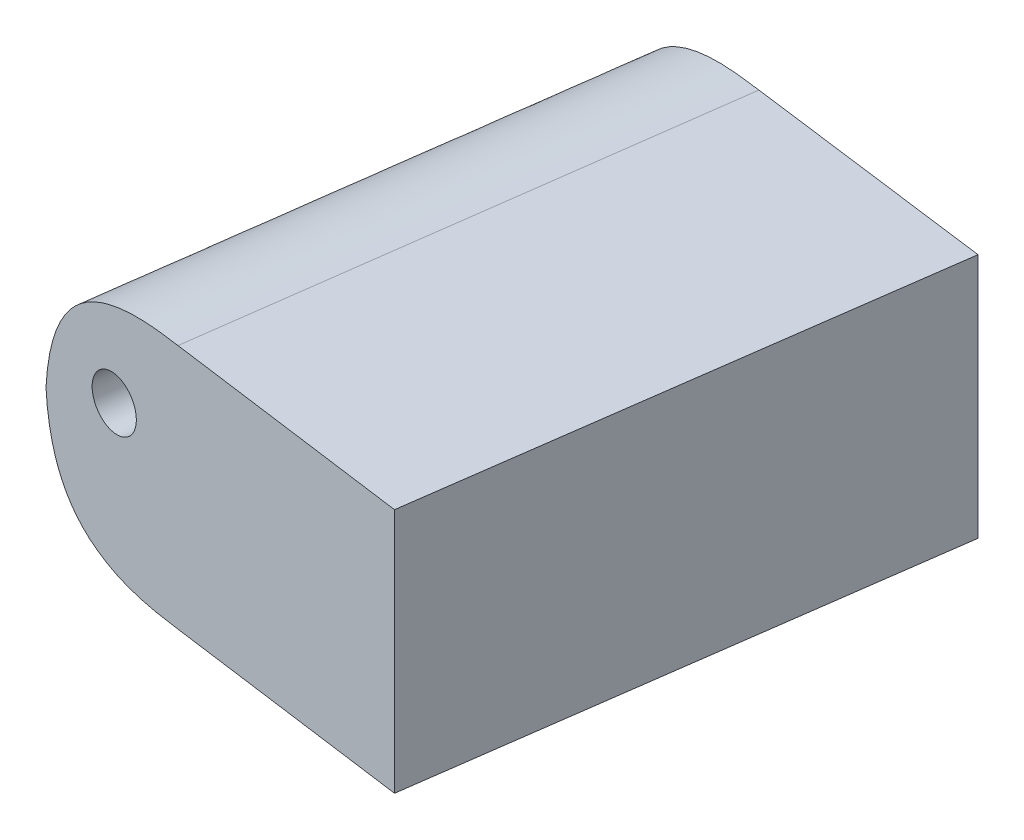
ISO-10303-21;
HEADER;
FILE_DESCRIPTION(('STEP AP214'),'2;1');
FILE_NAME('part.step','',(''),(''),'','','');
FILE_SCHEMA(('AUTOMOTIVE_DESIGN { 1 0 10303 214 1 1 1 1 }'));
ENDSEC;
DATA;
#1=APPLICATION_CONTEXT('core data for automotive mechanical design processes');
#2=APPLICATION_PROTOCOL_DEFINITION('international standard','automotive_design',2000,#1);
#3=PRODUCT_CONTEXT('',#1,'mechanical');
#4=PRODUCT('Part','Part','',(#3));
#5=PRODUCT_RELATED_PRODUCT_CATEGORY('part','',(#4));
#6=PRODUCT_DEFINITION_FORMATION('','',#4);
#7=PRODUCT_DEFINITION_CONTEXT('part definition',#1,'design');
#8=PRODUCT_DEFINITION('design','',#6,#7);
#9=PRODUCT_DEFINITION_SHAPE('','',#8);
#10=(LENGTH_UNIT() NAMED_UNIT(*) SI_UNIT(.MILLI.,.METRE.));
#11=(NAMED_UNIT(*) PLANE_ANGLE_UNIT() SI_UNIT($,.RADIAN.));
#12=(NAMED_UNIT(*) SI_UNIT($,.STERADIAN.) SOLID_ANGLE_UNIT());
#13=UNCERTAINTY_MEASURE_WITH_UNIT(LENGTH_MEASURE(1.E-05),#10,'distance_accuracy_value','');
#14=(GEOMETRIC_REPRESENTATION_CONTEXT(3) GLOBAL_UNCERTAINTY_ASSIGNED_CONTEXT((#13)) GLOBAL_UNIT_ASSIGNED_CONTEXT((#10,
#11,#12)) REPRESENTATION_CONTEXT('',''));
#15=CARTESIAN_POINT('',(0.,0.,0.));
#16=DIRECTION('',(0.,0.,1.));
#17=DIRECTION('',(1.,0.,0.));
#18=AXIS2_PLACEMENT_3D('',#15,#16,#17);
#19=CARTESIAN_POINT('',(-26.8764323882706,9.525,-11.3170154040948));
#20=DIRECTION('',(-0.990563834972414,0.,-0.137052139146914));
#21=DIRECTION('',(-0.137052139146914,0.,0.990563834972414));
#22=AXIS2_PLACEMENT_3D('',#19,#20,#21);
#23=PLANE('',#22);
#24=DIRECTION('',(0.137052139146914,0.,-0.990563834972414));
#25=VECTOR('',#24,1.);
#26=CARTESIAN_POINT('',(-26.8764323882706,0.,-11.3170154040948));
#27=LINE('',#26,#25);
#28=CARTESIAN_POINT('',(-29.6265442564145,0.,8.55980939899429));
#29=VERTEX_POINT('',#28);
#30=CARTESIAN_POINT('',(-26.8764323882706,0.,-11.3170154040948));
#31=VERTEX_POINT('',#30);
#32=EDGE_CURVE('E129',#29,#31,#27,.T.);
#33=ORIENTED_EDGE('',*,*,#32,.T.);
#34=DIRECTION('',(0.,-1.,0.));
#35=VECTOR('',#34,1.);
#36=CARTESIAN_POINT('',(-26.8764323882706,9.525,-11.3170154040948));
#37=LINE('',#36,#35);
#38=CARTESIAN_POINT('',(-26.8764323882706,9.525,-11.3170154040948));
#39=VERTEX_POINT('',#38);
#40=EDGE_CURVE('E110',#39,#31,#37,.T.);
#41=ORIENTED_EDGE('',*,*,#40,.F.);
#42=DIRECTION('',(0.137052139146914,0.,-0.990563834972414));
#43=VECTOR('',#42,1.);
#44=CARTESIAN_POINT('',(-26.8764323882706,9.525,-11.3170154040948));
#45=LINE('',#44,#43);
#46=CARTESIAN_POINT('',(-29.6265442564145,9.525,8.55980939899429));
#47=VERTEX_POINT('',#46);
#48=EDGE_CURVE('E118',#47,#39,#45,.T.);
#49=ORIENTED_EDGE('',*,*,#48,.F.);
#50=DIRECTION('',(0.,-1.,0.));
#51=VECTOR('',#50,1.);
#52=CARTESIAN_POINT('',(-29.6265442564145,9.525,8.55980939899429));
#53=LINE('',#52,#51);
#54=EDGE_CURVE('E131',#47,#29,#53,.T.);
#55=ORIENTED_EDGE('',*,*,#54,.T.);
#56=EDGE_LOOP('',(#33,#41,#49,#55));
#57=FACE_BOUND('',#56,.T.);
#58=ADVANCED_FACE('F53',(#57),#23,.F.);
#59=CARTESIAN_POINT('',(-42.6007112345076,9.525,-13.3780058589725));
#60=DIRECTION('',(-0.129959025005187,0.,0.991519365327628));
#61=DIRECTION('',(0.991519365327628,0.,0.129959025005187));
#62=AXIS2_PLACEMENT_3D('',#59,#60,#61);
#63=PLANE('',#62);
#64=CARTESIAN_POINT('',(-39.5944244871057,5.969,-12.9839700909981));
#65=DIRECTION('',(0.129959025005187,0.,-0.991519365327628));
#66=DIRECTION('',(-0.991519365327628,0.,-0.129959025005187));
#67=AXIS2_PLACEMENT_3D('',#64,#65,#66);
#68=CIRCLE('',#67,2.032);
#69=CARTESIAN_POINT('',(-41.6091918374514,5.969,-13.2480468298086));
#70=VERTEX_POINT('',#69);
#71=EDGE_CURVE('E139',#70,#70,#68,.T.);
#72=ORIENTED_EDGE('',*,*,#71,.F.);
#73=EDGE_LOOP('',(#72));
#74=FACE_BOUND('',#73,.T.);
#75=CARTESIAN_POINT('',(-42.5732892059843,4.76250042327569,-13.3744116376036));
#76=CARTESIAN_POINT('',(-42.5647958977979,4.62809784797724,-13.3732990782794));
#77=CARTESIAN_POINT('',(-42.553743054954,4.49379104343409,-13.371870272776));
#78=CARTESIAN_POINT('',(-42.5247729563878,4.21849101499363,-13.3681420552876));
#79=CARTESIAN_POINT('',(-42.506512657539,4.07753479702576,-13.3657992165633));
#80=CARTESIAN_POINT('',(-42.4727809971869,3.86452101191241,-13.3614677959091));
#81=CARTESIAN_POINT('',(-42.4602064141451,3.79199611332065,-13.3598525979796));
#82=CARTESIAN_POINT('',(-42.4324934385158,3.6458524221412,-13.3562902671087));
#83=CARTESIAN_POINT('',(-42.4173064371706,3.57224294453682,-13.3543368350782));
#84=CARTESIAN_POINT('',(-42.3840891718527,3.42421259612409,-13.350060222277));
#85=CARTESIAN_POINT('',(-42.3660105618139,3.34980271301365,-13.3477307466914));
#86=CARTESIAN_POINT('',(-42.3267283174173,3.20049686394299,-13.3426639617381));
#87=CARTESIAN_POINT('',(-42.3054776760046,3.12561342269257,-13.3399205093968));
#88=CARTESIAN_POINT('',(-42.2595680625844,2.97572827201594,-13.3339874653526));
#89=CARTESIAN_POINT('',(-42.2348643250654,2.90074045458113,-13.3307920060353));
#90=CARTESIAN_POINT('',(-42.1817651823831,2.75105185464563,-13.3239166429932));
#91=CARTESIAN_POINT('',(-42.1533278206104,2.67636614643373,-13.3202312263371));
#92=CARTESIAN_POINT('',(-42.0924812694144,2.52772117270588,-13.3123380654591));
#93=CARTESIAN_POINT('',(-42.0600329384801,2.45377816099321,-13.308125167626));
#94=CARTESIAN_POINT('',(-41.9908829419822,2.30707307555885,-13.2991390010622));
#95=CARTESIAN_POINT('',(-41.9541440113329,2.23432874289674,-13.2943608171706));
#96=CARTESIAN_POINT('',(-41.8957801589619,2.12670551961301,-13.286763712819));
#97=CARTESIAN_POINT('',(-41.8757099790418,2.09096242662776,-13.2841501923355));
#98=CARTESIAN_POINT('',(-41.834401999416,2.01995293692127,-13.2787689626195));
#99=CARTESIAN_POINT('',(-41.813159391443,1.98468937718113,-13.276000617704));
#100=CARTESIAN_POINT('',(-41.7694744435022,1.91469848113969,-13.2703053907542));
#101=CARTESIAN_POINT('',(-41.7470270117249,1.87997437698258,-13.2673778350414));
#102=CARTESIAN_POINT('',(-41.7008999550341,1.81111869084117,-13.2613597949436));
#103=CARTESIAN_POINT('',(-41.6772148018876,1.77699087312801,-13.2582685785931));
#104=CARTESIAN_POINT('',(-41.6285804588179,1.70938226987987,-13.2519189076482));
#105=CARTESIAN_POINT('',(-41.6036251414069,1.67590596578158,-13.2486596411229));
#106=CARTESIAN_POINT('',(-41.5524189628733,1.60965172149761,-13.2419696057797));
#107=CARTESIAN_POINT('',(-41.5261612042989,1.57687920161246,-13.2385379222802));
#108=CARTESIAN_POINT('',(-41.4723190033124,1.51207995581395,-13.2314988380954));
#109=CARTESIAN_POINT('',(-41.444726727298,1.48005984908226,-13.2278903977123));
#110=CARTESIAN_POINT('',(-41.388184637583,1.41680795091697,-13.2204936236189));
#111=CARTESIAN_POINT('',(-41.3592259054556,1.38558426804663,-13.2167041051652));
#112=CARTESIAN_POINT('',(-41.2999202769971,1.32396185645937,-13.2089410283843));
#113=CARTESIAN_POINT('',(-41.269563263105,1.29357303312973,-13.2049661246921));
#114=CARTESIAN_POINT('',(-41.20743246355,1.23365173551807,-13.1968284002191));
#115=CARTESIAN_POINT('',(-41.1756473633469,1.20413119809158,-13.192664073311));
#116=CARTESIAN_POINT('',(-41.1106379117189,1.1459765630196,-13.184144458969));
#117=CARTESIAN_POINT('',(-41.0774012602499,1.11735645839199,-13.1797875326404));
#118=CARTESIAN_POINT('',(-41.0094734171707,1.06103264844363,-13.170880649869));
#119=CARTESIAN_POINT('',(-40.9747692245022,1.03334490284984,-13.166328959629));
#120=CARTESIAN_POINT('',(-40.9038983369239,0.978915515873346,-13.1570314714318));
#121=CARTESIAN_POINT('',(-40.867718239456,0.952191640320728,-13.1522838847861));
#122=CARTESIAN_POINT('',(-40.7938949822682,0.899719307596912,-13.1425945282852));
#123=CARTESIAN_POINT('',(-40.7562383149864,0.873990199891915,-13.1376509545929));
#124=CARTESIAN_POINT('',(-40.6794688072314,0.823536151644567,-13.1275705568274));
#125=CARTESIAN_POINT('',(-40.6403426324152,0.798831872170548,-13.1224319511875));
#126=CARTESIAN_POINT('',(-40.5606484521346,0.750455454108743,-13.1119634311337));
#127=CARTESIAN_POINT('',(-40.5200675333938,0.726804981129649,-13.1066317908757));
#128=CARTESIAN_POINT('',(-40.4374856125969,0.680563123019994,-13.0957801452615));
#129=CARTESIAN_POINT('',(-40.3954723274306,0.657994081068855,-13.0902584981186));
#130=CARTESIAN_POINT('',(-40.3100547325321,0.613940717136585,-13.0790307716878));
#131=CARTESIAN_POINT('',(-40.2666389358746,0.592479083592643,-13.0733231572748));
#132=CARTESIAN_POINT('',(-40.1784524735771,0.550664502490672,-13.061728389582));
#133=CARTESIAN_POINT('',(-40.1336712381129,0.530334263479674,-13.0558398244101));
#134=CARTESIAN_POINT('',(-40.0427970658191,0.490804456772829,-13.0438889966318));
#135=CARTESIAN_POINT('',(-39.9966945568674,0.47162731159011,-13.0378254565076));
#136=CARTESIAN_POINT('',(-39.9032270630086,0.434423039424043,-13.0255313417205));
#137=CARTESIAN_POINT('',(-39.8558535353756,0.416417765257426,-13.0192996284792));
#138=CARTESIAN_POINT('',(-39.7599012416368,0.381574396294286,-13.0066769068999));
#139=CARTESIAN_POINT('',(-39.7113149951149,0.364757346571228,-13.0002849034894));
#140=CARTESIAN_POINT('',(-39.5628315482338,0.315743247934743,-12.9807496721169));
#141=CARTESIAN_POINT('',(-39.4622049465041,0.285773055919237,-12.9675096937149));
#142=CARTESIAN_POINT('',(-39.2569558339936,0.230538213950909,-12.940504085472));
#143=CARTESIAN_POINT('',(-39.1522968657922,0.205413075320201,-12.9267336615808));
#144=CARTESIAN_POINT('',(-38.9395668609517,0.159849425665994,-12.8987462091978));
#145=CARTESIAN_POINT('',(-38.8314715563698,0.139526866741655,-12.8845260393316));
#146=CARTESIAN_POINT('',(-38.6124853099318,0.103449913614241,-12.8557225140639));
#147=CARTESIAN_POINT('',(-38.5015796809641,0.0877871469969634,-12.8411373115314));
#148=CARTESIAN_POINT('',(-38.2775659546188,0.0607837106360176,-12.8116840264542));
#149=CARTESIAN_POINT('',(-38.1644498387937,0.0495116711115955,-12.796814991291));
#150=CARTESIAN_POINT('',(-37.9365341254753,0.0308780311281911,-12.7668642807237));
#151=CARTESIAN_POINT('',(-37.8217306694735,0.0235651990272983,-12.7517822024035));
#152=CARTESIAN_POINT('',(-37.590832601146,0.0122782293590347,-12.7214586705435));
#153=CARTESIAN_POINT('',(-37.4747364914305,0.00833797882012555,-12.7062171220861));
#154=CARTESIAN_POINT('',(-37.1229572727762,0.000113538461828667,-12.6600497854791));
#155=CARTESIAN_POINT('',(-36.8871597244518,-0.000351603179588617,-12.6291250339052));
#156=CARTESIAN_POINT('',(-36.6515433930548,0.,-12.5982449392128));
#157=B_SPLINE_CURVE_WITH_KNOTS('',3,(#75,#76,#77,#78,#79,#80,#81,#82,#83,#84,#85,#86,#87,#88,
#89,#90,#91,#92,#93,#94,#95,#96,#97,#98,#99,#100,#101,#102,#103,#104,#105,#106,#107,#108,#109,
#110,#111,#112,#113,#114,#115,#116,#117,#118,#119,#120,#121,#122,#123,#124,#125,#126,#127,#128,
#129,#130,#131,#132,#133,#134,#135,#136,#137,#138,#139,#140,#141,#142,#143,#144,#145,#146,#147,
#148,#149,#150,#151,#152,#153,#154,#155,#156),.UNSPECIFIED.,.F.,.F.,(4,2,2,2,2,2,2,2,2,2,2,2,2,
2,2,2,2,2,2,2,2,2,2,2,2,2,2,2,2,2,2,2,2,2,2,2,2,2,2,2,4),(0.,0.404114168840457,
0.830378471591303,1.05121962296759,1.2767325515803,1.50651098932134,1.74011407212345,
1.9770887339085,2.21700021740357,2.45947153305623,2.70423212388337,2.8274433041151,
2.95120399512992,3.07553676376821,3.20048238269704,3.32610175991265,3.45247770278985,
3.57971643402706,3.70794877326394,3.83733073279795,3.96803593068444,4.10023544924245,
4.23409012154197,4.36974766730105,4.50734013965957,4.64698171868899,4.78876690217423,
4.93276912611677,5.07903983133111,5.22760797932652,5.37848001074875,5.5316402329531,
5.68705161945368,6.00435004548754,6.32974120407924,6.66232947111887,7.00108069383517,
7.34493259616978,7.69292880510658,8.0443818860083,8.75751923929178),.UNSPECIFIED.);
#158=CARTESIAN_POINT('',(-36.6515433930548,0.,-12.5982449392128));
#159=VERTEX_POINT('',#158);
#160=CARTESIAN_POINT('',(-42.5732848257656,4.76250027694889,-13.3744110634857));
#161=VERTEX_POINT('',#160);
#162=EDGE_CURVE('E74',#159,#161,#157,.F.);
#163=ORIENTED_EDGE('',*,*,#162,.T.);
#164=CARTESIAN_POINT('',(-36.6515433930551,9.525,-12.5982449392128));
#165=CARTESIAN_POINT('',(-36.8871597128886,9.52535160311408,-12.62912503239));
#166=CARTESIAN_POINT('',(-37.1229572496091,9.52488646156102,-12.6600497824381));
#167=CARTESIAN_POINT('',(-37.4747364505127,9.51666202238325,-12.7062171167042));
#168=CARTESIAN_POINT('',(-37.5908325540556,9.51272177242049,-12.7214586643466));
#169=CARTESIAN_POINT('',(-37.8217306098353,9.50143480441091,-12.7517821945478));
#170=CARTESIAN_POINT('',(-37.936534059462,9.4941219733965,-12.7668642720242));
#171=CARTESIAN_POINT('',(-38.1644497599251,9.47548833619764,-12.7968149808884));
#172=CARTESIAN_POINT('',(-38.2775658692696,9.46421629837329,-12.8116840151923));
#173=CARTESIAN_POINT('',(-38.5015795826722,9.43721286611362,-12.841137298552));
#174=CARTESIAN_POINT('',(-38.6124852051768,9.42155010189571,-12.855722500226));
#175=CARTESIAN_POINT('',(-38.831471438848,9.38547315433752,-12.8845260237974));
#176=CARTESIAN_POINT('',(-38.9395667371238,9.36515059857601,-12.8987461928251));
#177=CARTESIAN_POINT('',(-39.1522967296605,9.31958695607113,-12.9267336435718));
#178=CARTESIAN_POINT('',(-39.2569556918592,9.29446182141409,-12.9405040666643));
#179=CARTESIAN_POINT('',(-39.4622047928148,9.23922698825737,-12.9675096733694));
#180=CARTESIAN_POINT('',(-39.5628313889839,9.20925680106149,-12.9807496510314));
#181=CARTESIAN_POINT('',(-39.711314827947,9.16024271036438,-13.0002848813498));
#182=CARTESIAN_POINT('',(-39.7599010719076,9.14342566338049,-13.0066768844194));
#183=CARTESIAN_POINT('',(-39.8558533606841,9.1085823001173,-13.0192996053382));
#184=CARTESIAN_POINT('',(-39.9032268859144,9.09057702890852,-13.0255313182596));
#185=CARTESIAN_POINT('',(-39.9966943751415,9.05337276288089,-13.0378254324302));
#186=CARTESIAN_POINT('',(-40.0427968818622,9.03419562087579,-13.0438889722576));
#187=CARTESIAN_POINT('',(-40.1336710498789,8.9946658207478,-13.0558397994667));
#188=CARTESIAN_POINT('',(-40.1784522832949,8.97433558513517,-13.0617283643661));
#189=CARTESIAN_POINT('',(-40.2666387416903,8.93252101105383,-13.0733231315398));
#190=CARTESIAN_POINT('',(-40.3100545364915,8.91105938112954,-13.079030745706));
#191=CARTESIAN_POINT('',(-40.3954721278789,8.86700602466033,-13.09025847167));
#192=CARTESIAN_POINT('',(-40.437485411388,8.84443698655038,-13.0957801185926));
#193=CARTESIAN_POINT('',(-40.5200673290768,8.79819513634636,-13.1066317637939));
#194=CARTESIAN_POINT('',(-40.5606482463643,8.77454466743004,-13.1119634038589));
#195=CARTESIAN_POINT('',(-40.640342423947,8.7261682577162,-13.1224319235546));
#196=CARTESIAN_POINT('',(-40.6794685975162,8.70146398252638,-13.1275705290291));
#197=CARTESIAN_POINT('',(-40.7562381029856,8.65100994306877,-13.1376509264916));
#198=CARTESIAN_POINT('',(-40.7938947692266,8.62528083986914,-13.1425945000461));
#199=CARTESIAN_POINT('',(-40.8677180245382,8.5728085163761,-13.1522838562988));
#200=CARTESIAN_POINT('',(-40.903898121169,8.54608464554966,-13.1570314428339));
#201=CARTESIAN_POINT('',(-40.974769007272,8.49165526824416,-13.1663289308365));
#202=CARTESIAN_POINT('',(-41.0094731993015,8.46396752759694,-13.1708806209923));
#203=CARTESIAN_POINT('',(-41.0774010412924,8.40764372775899,-13.1797875036209));
#204=CARTESIAN_POINT('',(-41.1106376923122,8.37902362829797,-13.1841444298907));
#205=CARTESIAN_POINT('',(-41.1756471432192,8.32086900377511,-13.1926640441388));
#206=CARTESIAN_POINT('',(-41.2074322431516,8.29134847173487,-13.1968283710119));
#207=CARTESIAN_POINT('',(-41.2695630423276,8.23142718511035,-13.2049660954367));
#208=CARTESIAN_POINT('',(-41.2999200561135,8.20103836738615,-13.2089409991159));
#209=CARTESIAN_POINT('',(-41.359225684511,8.13941596721555,-13.2167040758909));
#210=CARTESIAN_POINT('',(-41.3881844166869,8.10819229016139,-13.2204935943521));
#211=CARTESIAN_POINT('',(-41.4447265066483,8.04494040381652,-13.2278903684806));
#212=CARTESIAN_POINT('',(-41.4723187828644,8.0129203030939,-13.2314988088916));
#213=CARTESIAN_POINT('',(-41.5261609844028,7.94812106948312,-13.2385378931521));
#214=CARTESIAN_POINT('',(-41.5524187433314,7.9153485557812,-13.2419695766999));
#215=CARTESIAN_POINT('',(-41.6036249227203,7.84909432401471,-13.2486596121592));
#216=CARTESIAN_POINT('',(-41.6285802406364,7.81561802625484,-13.2519188787529));
#217=CARTESIAN_POINT('',(-41.6772145848617,7.7480094358161,-13.2582685498539));
#218=CARTESIAN_POINT('',(-41.7008997386625,7.71388162457766,-13.2613597662926));
#219=CARTESIAN_POINT('',(-41.7470267968051,7.64502595149983,-13.2673778065859));
#220=CARTESIAN_POINT('',(-41.7694742293835,7.6103018539349,-13.2703053624064));
#221=CARTESIAN_POINT('',(-41.8131591790672,7.54031097117397,-13.2760005895905));
#222=CARTESIAN_POINT('',(-41.8344017879853,7.50504741812504,-13.2787689346329));
#223=CARTESIAN_POINT('',(-41.875709769639,7.43403794187929,-13.2841501646211));
#224=CARTESIAN_POINT('',(-41.8957799506449,7.39829485566604,-13.2867636852502));
#225=CARTESIAN_POINT('',(-41.9541438063731,7.29067165291624,-13.2943607900523));
#226=CARTESIAN_POINT('',(-41.9908827396177,7.21792733398184,-13.2991389742914));
#227=CARTESIAN_POINT('',(-42.0600327417979,7.07122227610879,-13.3081251416156));
#228=CARTESIAN_POINT('',(-42.0924810758347,6.99727927824193,-13.3123380398636));
#229=CARTESIAN_POINT('',(-42.1533276336883,6.84863433219997,-13.3202312016313));
#230=CARTESIAN_POINT('',(-42.1817649990261,6.77394863783716,-13.3239166187637));
#231=CARTESIAN_POINT('',(-42.2348641492434,6.62426006549527,-13.3307919828116));
#232=CARTESIAN_POINT('',(-42.2595678907377,6.54927226181196,-13.3339874426593));
#233=CARTESIAN_POINT('',(-42.3054775124564,6.39938713845278,-13.3399204878101));
#234=CARTESIAN_POINT('',(-42.3267281581947,6.32450371077411,-13.3426639407279));
#235=CARTESIAN_POINT('',(-42.3660104115248,6.17519788859932,-13.347730726871));
#236=CARTESIAN_POINT('',(-42.3840890261719,6.1007880188182,-13.35006020307));
#237=CARTESIAN_POINT('',(-42.4173063009168,5.95275769677425,-13.3543368171252));
#238=CARTESIAN_POINT('',(-42.43249330708,5.87914823221428,-13.3562902497962));
#239=CARTESIAN_POINT('',(-42.4602062924734,5.73300456681303,-13.359852581964));
#240=CARTESIAN_POINT('',(-42.4727808804608,5.66047968095986,-13.36146778055));
#241=CARTESIAN_POINT('',(-42.5065125555083,5.44746593339397,-13.3657992031531));
#242=CARTESIAN_POINT('',(-42.5247728643959,5.30650973999141,-13.3681420432063));
#243=CARTESIAN_POINT('',(-42.5537429824402,5.03120975966589,-13.371870263266));
#244=CARTESIAN_POINT('',(-42.5647958347616,4.8969029787074,-13.373299070017));
#245=CARTESIAN_POINT('',(-42.5732891521375,4.76250042674533,-13.3744116305458));
#246=B_SPLINE_CURVE_WITH_KNOTS('',3,(#164,#165,#166,#167,#168,#169,#170,#171,#172,#173,#174,
#175,#176,#177,#178,#179,#180,#181,#182,#183,#184,#185,#186,#187,#188,#189,#190,#191,#192,#193,
#194,#195,#196,#197,#198,#199,#200,#201,#202,#203,#204,#205,#206,#207,#208,#209,#210,#211,#212,
#213,#214,#215,#216,#217,#218,#219,#220,#221,#222,#223,#224,#225,#226,#227,#228,#229,#230,#231,
#232,#233,#234,#235,#236,#237,#238,#239,#240,#241,#242,#243,#244,#245),.UNSPECIFIED.,.F.,.F.,(4,
2,2,2,2,2,2,2,2,2,2,2,2,2,2,2,2,2,2,2,2,2,2,2,2,2,2,2,2,2,2,2,2,2,2,2,2,2,2,2,4),(0.,
0.7131373182425,1.06459038042347,1.41258656991711,1.75643845225367,2.0951896546276,
2.42777790120027,2.75316903939687,3.07046744524933,3.22587882175653,3.3790390340346,
3.529911055588,3.67847919375448,3.82474988915411,3.96875210326216,4.11053727685099,
4.25017884587203,4.38777130805285,4.52342884340118,4.65728350498781,4.7894830124577,
4.92018819880517,5.04957014627349,5.1778024728754,5.30504119091319,5.43141712004197,
5.55703648298251,5.68198208713793,5.80631484053748,5.93007551588499,6.05328668006023,
6.29804723777519,6.54051851925598,6.78042996784234,7.01740459427676,7.25100764154124,
7.4807860437648,7.7062989370353,7.92714005334605,8.35340428693263,8.75751838762713),.UNSPECIFIED.);
#247=CARTESIAN_POINT('',(-36.6515433930551,9.525,-12.5982449392128));
#248=VERTEX_POINT('',#247);
#249=EDGE_CURVE('E67',#161,#248,#246,.F.);
#250=ORIENTED_EDGE('',*,*,#249,.T.);
#251=DIRECTION('',(-0.991519365327628,0.,-0.129959025005187));
#252=VECTOR('',#251,1.);
#253=CARTESIAN_POINT('',(-42.6007112345076,9.525,-13.3780058589725));
#254=LINE('',#253,#252);
#255=EDGE_CURVE('E106',#39,#248,#254,.T.);
#256=ORIENTED_EDGE('',*,*,#255,.F.);
#257=ORIENTED_EDGE('',*,*,#40,.T.);
#258=DIRECTION('',(-0.991519365327628,0.,-0.129959025005187));
#259=VECTOR('',#258,1.);
#260=CARTESIAN_POINT('',(-42.6007112345076,0.,-13.3780058589725));
#261=LINE('',#260,#259);
#262=EDGE_CURVE('E150',#31,#159,#261,.T.);
#263=ORIENTED_EDGE('',*,*,#262,.T.);
#264=EDGE_LOOP('',(#163,#250,#256,#257,#263));
#265=FACE_BOUND('',#264,.T.);
#266=ADVANCED_FACE('F108',(#74,#265),#63,.F.);
#267=CARTESIAN_POINT('',(-29.6265442564145,9.525,8.55980939899429));
#268=DIRECTION('',(0.134089514644196,0.,-0.990969223569776));
#269=DIRECTION('',(-0.990969223569776,0.,-0.134089514644196));
#270=AXIS2_PLACEMENT_3D('',#267,#268,#269);
#271=PLANE('',#270);
#272=CARTESIAN_POINT('',(-42.1952694970725,5.969,6.85911655492695));
#273=DIRECTION('',(0.134089514644196,0.,-0.990969223569776));
#274=DIRECTION('',(-0.990969223569776,0.,-0.134089514644196));
#275=AXIS2_PLACEMENT_3D('',#272,#273,#274);
#276=ELLIPSE('',#275,1.00000871387596,1.000000032);
#277=CARTESIAN_POINT('',(-43.1862473558252,5.969,6.72502587184335));
#278=VERTEX_POINT('',#277);
#279=EDGE_CURVE('E137',#278,#278,#276,.T.);
#280=ORIENTED_EDGE('',*,*,#279,.T.);
#281=EDGE_LOOP('',(#280));
#282=FACE_BOUND('',#281,.T.);
#283=DIRECTION('',(0.990969223569776,0.,0.134089514644196));
#284=VECTOR('',#283,1.);
#285=CARTESIAN_POINT('',(-29.6265442564145,9.525,8.55980939899429));
#286=LINE('',#285,#284);
#287=CARTESIAN_POINT('',(-39.3366861859724,9.525,7.24591570028752));
#288=VERTEX_POINT('',#287);
#289=EDGE_CURVE('E117',#288,#47,#286,.T.);
#290=ORIENTED_EDGE('',*,*,#289,.F.);
#291=CARTESIAN_POINT('',(-45.2825015273915,3.525,6.44137861242268));
#292=CARTESIAN_POINT('',(-45.2825015273911,4.53418830920277,6.44137861242273));
#293=CARTESIAN_POINT('',(-45.2825015273911,5.54337661840555,6.44137861242273));
#294=CARTESIAN_POINT('',(-44.8562346105703,7.7676406871202,6.49905742083112));
#295=CARTESIAN_POINT('',(-43.5410125335617,9.0948484809826,6.67702206974237));
#296=CARTESIAN_POINT('',(-41.336835296387,9.525,6.97527255915647));
#297=CARTESIAN_POINT('',(-40.3367607411797,9.525,7.11059412972219));
#298=CARTESIAN_POINT('',(-39.3366861859724,9.525,7.24591570028791));
#299=B_SPLINE_CURVE_WITH_KNOTS('',5,(#291,#292,#293,#294,#295,#296,#297,#298),.UNSPECIFIED.,.F.,
.F.,(6,2,6),(0.,0.5,1.),.UNSPECIFIED.);
#300=CARTESIAN_POINT('',(-45.2550935317883,4.76250424083748,6.44508722893669));
#301=VERTEX_POINT('',#300);
#302=EDGE_CURVE('E224',#288,#301,#299,.F.);
#303=ORIENTED_EDGE('',*,*,#302,.T.);
#304=CARTESIAN_POINT('',(-39.3366861859723,0.,7.24591570028814));
#305=CARTESIAN_POINT('',(-40.3367607411795,0.,7.11059412972242));
#306=CARTESIAN_POINT('',(-41.3368352963868,0.,6.9752725591567));
#307=CARTESIAN_POINT('',(-43.5410125335629,0.430151519016089,6.67702206974197));
#308=CARTESIAN_POINT('',(-44.8562346105706,1.75735931288097,6.49905742083072));
#309=CARTESIAN_POINT('',(-45.2825015273909,3.98162338159434,6.44137861242257));
#310=CARTESIAN_POINT('',(-45.2825015273909,4.99081169079717,6.44137861242296));
#311=CARTESIAN_POINT('',(-45.2825015273915,6.,6.44137861242287));
#312=B_SPLINE_CURVE_WITH_KNOTS('',5,(#304,#305,#306,#307,#308,#309,#310,#311),.UNSPECIFIED.,.F.,
.F.,(6,2,6),(0.,0.5,1.),.UNSPECIFIED.);
#313=CARTESIAN_POINT('',(-39.3366861859722,0.,7.24591570028755));
#314=VERTEX_POINT('',#313);
#315=EDGE_CURVE('E133',#301,#314,#312,.F.);
#316=ORIENTED_EDGE('',*,*,#315,.T.);
#317=DIRECTION('',(0.990969223569776,0.,0.134089514644196));
#318=VECTOR('',#317,1.);
#319=CARTESIAN_POINT('',(-29.6265442564145,0.,8.55980939899429));
#320=LINE('',#319,#318);
#321=EDGE_CURVE('E126',#314,#29,#320,.T.);
#322=ORIENTED_EDGE('',*,*,#321,.T.);
#323=ORIENTED_EDGE('',*,*,#54,.F.);
#324=EDGE_LOOP('',(#290,#303,#316,#322,#323));
#325=FACE_BOUND('',#324,.T.);
#326=ADVANCED_FACE('F173',(#282,#325),#271,.F.);
#327=CARTESIAN_POINT('',(0.,9.525,0.));
#328=DIRECTION('',(0.,-1.,0.));
#329=DIRECTION('',(0.,0.,-1.));
#330=AXIS2_PLACEMENT_3D('',#327,#328,#329);
#331=PLANE('',#330);
#332=ORIENTED_EDGE('',*,*,#255,.T.);
#333=CARTESIAN_POINT('',(-39.4709433256187,9.525,8.23812373226248));
#334=CARTESIAN_POINT('',(-38.4863909682121,9.525,0.961931497781003));
#335=CARTESIAN_POINT('',(-37.5018386108154,9.525,-6.31426073670631));
#336=CARTESIAN_POINT('',(-36.5172862534088,9.525,-13.5904529711878));
#337=B_SPLINE_CURVE_WITH_KNOTS('',3,(#333,#334,#335,#336),.UNSPECIFIED.,.F.,.F.,(4,4),
(-0.00857113543897676,0.0134563667117127),.UNSPECIFIED.);
#338=EDGE_CURVE('E130',#248,#288,#337,.F.);
#339=ORIENTED_EDGE('',*,*,#338,.T.);
#340=ORIENTED_EDGE('',*,*,#289,.T.);
#341=ORIENTED_EDGE('',*,*,#48,.T.);
#342=EDGE_LOOP('',(#332,#339,#340,#341));
#343=FACE_BOUND('',#342,.T.);
#344=ADVANCED_FACE('F121',(#343),#331,.F.);
#345=CARTESIAN_POINT('',(0.,0.,0.));
#346=DIRECTION('',(0.,-1.,0.));
#347=DIRECTION('',(0.,0.,-1.));
#348=AXIS2_PLACEMENT_3D('',#345,#346,#347);
#349=PLANE('',#348);
#350=ORIENTED_EDGE('',*,*,#321,.F.);
#351=CARTESIAN_POINT('',(-36.5172862534088,0.,-13.5904529711878));
#352=CARTESIAN_POINT('',(-37.5018386108148,0.,-6.31426073669193));
#353=CARTESIAN_POINT('',(-38.4863909682138,0.,0.961931497806364));
#354=CARTESIAN_POINT('',(-39.4709433256187,0.,8.23812373226248));
#355=B_SPLINE_CURVE_WITH_KNOTS('',3,(#351,#352,#353,#354),.UNSPECIFIED.,.F.,.F.,(4,4),
(-0.0210012500977579,0.00102625205293156),.UNSPECIFIED.);
#356=EDGE_CURVE('E11',#314,#159,#355,.F.);
#357=ORIENTED_EDGE('',*,*,#356,.T.);
#358=ORIENTED_EDGE('',*,*,#262,.F.);
#359=ORIENTED_EDGE('',*,*,#32,.F.);
#360=EDGE_LOOP('',(#350,#357,#358,#359));
#361=FACE_BOUND('',#360,.T.);
#362=ADVANCED_FACE('F190',(#361),#349,.T.);
#363=CARTESIAN_POINT('',(-39.9453138546197,5.969,-10.3068678046135));
#364=DIRECTION('',(0.129959025005187,0.,-0.991519365327627));
#365=DIRECTION('',(-0.991519365327628,0.,-0.129959025005187));
#366=AXIS2_PLACEMENT_3D('',#363,#364,#365);
#367=CYLINDRICAL_SURFACE('',#366,2.032);
#368=CARTESIAN_POINT('',(-39.9453138546197,5.969,-10.3068678046135));
#369=DIRECTION('',(0.129959025005187,0.,-0.991519365327628));
#370=DIRECTION('',(-0.991519365327628,0.,-0.129959025005187));
#371=AXIS2_PLACEMENT_3D('',#368,#369,#370);
#372=CIRCLE('',#371,2.032);
#373=CARTESIAN_POINT('',(-41.9600812049654,5.969,-10.570944543424));
#374=VERTEX_POINT('',#373);
#375=EDGE_CURVE('E151',#374,#374,#372,.T.);
#376=ORIENTED_EDGE('',*,*,#375,.F.);
#377=EDGE_LOOP('',(#376));
#378=FACE_BOUND('',#377,.T.);
#379=ORIENTED_EDGE('',*,*,#71,.T.);
#380=EDGE_LOOP('',(#379));
#381=FACE_BOUND('',#380,.T.);
#382=ADVANCED_FACE('F199',(#378,#381),#367,.F.);
#383=CARTESIAN_POINT('',(-39.9453138546197,5.969,-10.3068678046135));
#384=DIRECTION('',(0.129959025005187,0.,-0.991519365327628));
#385=DIRECTION('',(-0.991519365327628,0.,-0.129959025005187));
#386=AXIS2_PLACEMENT_3D('',#383,#384,#385);
#387=PLANE('',#386);
#388=CARTESIAN_POINT('',(-39.9453138546197,5.969,-10.3068678046135));
#389=DIRECTION('',(0.129959025005187,0.,-0.991519365327628));
#390=DIRECTION('',(-0.991519365327628,0.,-0.129959025005187));
#391=AXIS2_PLACEMENT_3D('',#388,#389,#390);
#392=CIRCLE('',#391,1.000000032);
#393=CARTESIAN_POINT('',(-40.9368332516759,5.969,-10.4368268337774));
#394=VERTEX_POINT('',#393);
#395=EDGE_CURVE('E140',#394,#394,#392,.T.);
#396=ORIENTED_EDGE('',*,*,#395,.F.);
#397=EDGE_LOOP('',(#396));
#398=FACE_BOUND('',#397,.T.);
#399=ORIENTED_EDGE('',*,*,#375,.T.);
#400=EDGE_LOOP('',(#399));
#401=FACE_BOUND('',#400,.T.);
#402=ADVANCED_FACE('F333',(#398,#401),#387,.T.);
#403=CARTESIAN_POINT('',(-42.4665568244637,5.969,8.92889692351289));
#404=DIRECTION('',(0.129959025005187,0.,-0.991519365327628));
#405=DIRECTION('',(-0.991519365327628,0.,-0.129959025005187));
#406=AXIS2_PLACEMENT_3D('',#403,#404,#405);
#407=CYLINDRICAL_SURFACE('',#406,1.000000032);
#408=ORIENTED_EDGE('',*,*,#395,.T.);
#409=EDGE_LOOP('',(#408));
#410=FACE_BOUND('',#409,.T.);
#411=ORIENTED_EDGE('',*,*,#279,.F.);
#412=EDGE_LOOP('',(#411));
#413=FACE_BOUND('',#412,.T.);
#414=ADVANCED_FACE('F281',(#410,#413),#407,.F.);
#415=CARTESIAN_POINT('',(-39.4709433256187,0.,8.23812373226248));
#416=CARTESIAN_POINT('',(-38.4863909682138,0.,0.961931497806364));
#417=CARTESIAN_POINT('',(-37.5018386108148,0.,-6.31426073669193));
#418=CARTESIAN_POINT('',(-36.5172862534088,0.,-13.5904529711878));
#419=CARTESIAN_POINT('',(-40.471017880826,0.,8.10280216169676));
#420=CARTESIAN_POINT('',(-39.486465523421,0.,0.826609927240646));
#421=CARTESIAN_POINT('',(-38.5019131660221,4.30037398438747E-13,-6.44958230725765));
#422=CARTESIAN_POINT('',(-37.5173608086161,0.,-13.7257745417535));
#423=CARTESIAN_POINT('',(-41.4710924360333,0.,7.96748059113104));
#424=CARTESIAN_POINT('',(-40.4865400786283,0.,0.691288356674926));
#425=CARTESIAN_POINT('',(-39.5019877212293,3.29629959356587E-12,-6.58490387782337));
#426=CARTESIAN_POINT('',(-38.5174353638233,0.,-13.8610961123192));
#427=CARTESIAN_POINT('',(-43.6752696732188,0.430151519016499,7.66923010171694));
#428=CARTESIAN_POINT('',(-42.6907173157375,0.430151519012519,0.393037867257638));
#429=CARTESIAN_POINT('',(-41.7061649584149,0.430151519030828,-6.88315436727569));
#430=CARTESIAN_POINT('',(-40.7216126010089,0.430151519016499,-14.1593466017333));
#431=CARTESIAN_POINT('',(-44.9904917502202,1.75735931288071,7.49126545280569));
#432=CARTESIAN_POINT('',(-44.0059393927898,1.7573593128823,0.215073218346389));
#433=CARTESIAN_POINT('',(-43.0213870354163,1.75735931289026,-7.06111901618694));
#434=CARTESIAN_POINT('',(-42.0368346780103,1.75735931288071,-14.3373112506446));
#435=CARTESIAN_POINT('',(-45.4167586670374,3.98162338159264,7.4335866443973));
#436=CARTESIAN_POINT('',(-44.4322063096324,3.98162338160538,0.157394409938004));
#437=CARTESIAN_POINT('',(-43.4476539522335,3.98162338161175,-7.11879782455711));
#438=CARTESIAN_POINT('',(-42.4631015948275,3.98162338159264,-14.394990059053));
#439=CARTESIAN_POINT('',(-45.4167586670374,4.99081169079632,7.43358664439731));
#440=CARTESIAN_POINT('',(-44.4322063096324,4.99081169080269,0.157394409941188));
#441=CARTESIAN_POINT('',(-43.4476539522335,4.99081169080587,-7.11879782455711));
#442=CARTESIAN_POINT('',(-42.4631015948275,4.99081169079632,-14.394990059053));
#443=CARTESIAN_POINT('',(-45.4167586670374,6.,7.43358664439731));
#444=CARTESIAN_POINT('',(-44.4322063096377,6.,0.15739440994048));
#445=CARTESIAN_POINT('',(-43.4476539522325,6.,-7.11879782455698));
#446=CARTESIAN_POINT('',(-42.4631015948275,6.,-14.394990059053));
#447=B_SPLINE_SURFACE_WITH_KNOTS('',5,3,((#415,#416,#417,#418),(#419,#420,#421,#422),(#423,#424,
#425,#426),(#427,#428,#429,#430),(#431,#432,#433,#434),(#435,#436,#437,#438),(#439,#440,#441,
#442),(#443,#444,#445,#446)),.UNSPECIFIED.,.F.,.F.,.F.,(6,2,6),(4,4),(0.,0.5,1.),
(-0.0210012500977579,0.00102625205293156),.UNSPECIFIED.);
#448=CARTESIAN_POINT('',(-42.4356949924824,4.76250000000144,-14.3912816310624));
#449=CARTESIAN_POINT('',(-43.4202473498836,4.76249999998315,-7.11508939658078));
#450=CARTESIAN_POINT('',(-44.404799707285,4.76249999999534,0.161102837906294));
#451=CARTESIAN_POINT('',(-45.3893520646923,4.76250000000143,7.43729507238789));
#452=B_SPLINE_CURVE_WITH_KNOTS('',3,(#448,#449,#450,#451),.UNSPECIFIED.,.F.,.F.,(4,4),
(-0.00857113543897676,0.0134563667117127),.UNSPECIFIED.);
#453=EDGE_CURVE('E228',#161,#301,#452,.T.);
#454=ORIENTED_EDGE('',*,*,#453,.F.);
#455=ORIENTED_EDGE('',*,*,#162,.F.);
#456=ORIENTED_EDGE('',*,*,#356,.F.);
#457=ORIENTED_EDGE('',*,*,#315,.F.);
#458=EDGE_LOOP('',(#454,#455,#456,#457));
#459=FACE_BOUND('',#458,.T.);
#460=ADVANCED_FACE('F56',(#459),#447,.T.);
#461=CARTESIAN_POINT('',(-36.5172862534088,9.525,-13.5904529711878));
#462=CARTESIAN_POINT('',(-37.5018386108154,9.525,-6.31426073670631));
#463=CARTESIAN_POINT('',(-38.4863909682121,9.525,0.961931497781003));
#464=CARTESIAN_POINT('',(-39.4709433256187,9.525,8.23812373226248));
#465=CARTESIAN_POINT('',(-37.5173608086161,9.525,-13.7257745417535));
#466=CARTESIAN_POINT('',(-38.5019131660227,9.525,-6.44958230727203));
#467=CARTESIAN_POINT('',(-39.4864655234193,9.525,0.826609927215284));
#468=CARTESIAN_POINT('',(-40.471017880826,9.525,8.10280216169676));
#469=CARTESIAN_POINT('',(-38.5174353638233,9.525,-13.8610961123192));
#470=CARTESIAN_POINT('',(-39.50198772123,9.525,-6.58490387783775));
#471=CARTESIAN_POINT('',(-40.4865400786266,9.525,0.691288356649566));
#472=CARTESIAN_POINT('',(-41.4710924360333,9.525,7.96748059113104));
#473=CARTESIAN_POINT('',(-40.7216126010089,9.0948484809835,-14.1593466017333));
#474=CARTESIAN_POINT('',(-41.7061649581863,9.0948484809644,-6.88315436725185));
#475=CARTESIAN_POINT('',(-42.6907173157358,9.09484848097713,0.39303786723546));
#476=CARTESIAN_POINT('',(-43.6752696732188,9.0948484809835,7.66923010171694));
#477=CARTESIAN_POINT('',(-42.0368346780103,7.76764068711929,-14.3373112506446));
#478=CARTESIAN_POINT('',(-43.0213870353405,7.7676406871384,-7.0611190161631));
#479=CARTESIAN_POINT('',(-44.0059393927881,7.76764068712566,0.215073218324213));
#480=CARTESIAN_POINT('',(-44.9904917502202,7.76764068711929,7.49126545280569));
#481=CARTESIAN_POINT('',(-42.4631015948274,5.54337661840736,-14.394990059053));
#482=CARTESIAN_POINT('',(-43.4476539522341,5.54337661836915,-7.11879782457149));
#483=CARTESIAN_POINT('',(-44.4322063096307,5.54337661839462,0.157394409915828));
#484=CARTESIAN_POINT('',(-45.4167586670374,5.54337661840736,7.4335866443973));
#485=CARTESIAN_POINT('',(-42.4631015948274,4.53418830920368,-14.394990059053));
#486=CARTESIAN_POINT('',(-43.4476539522341,4.53418830918457,-7.11879782457149));
#487=CARTESIAN_POINT('',(-44.4322063096307,4.53418830919731,0.157394409915828));
#488=CARTESIAN_POINT('',(-45.4167586670374,4.53418830920368,7.4335866443973));
#489=CARTESIAN_POINT('',(-42.4631015948274,3.525,-14.394990059053));
#490=CARTESIAN_POINT('',(-43.4476539522305,3.525,-7.11879782457101));
#491=CARTESIAN_POINT('',(-44.4322063096343,3.525,0.157394409915349));
#492=CARTESIAN_POINT('',(-45.4167586670374,3.525,7.4335866443973));
#493=B_SPLINE_SURFACE_WITH_KNOTS('',5,3,((#461,#462,#463,#464),(#465,#466,#467,#468),(#469,#470,
#471,#472),(#473,#474,#475,#476),(#477,#478,#479,#480),(#481,#482,#483,#484),(#485,#486,#487,
#488),(#489,#490,#491,#492)),.UNSPECIFIED.,.F.,.F.,.F.,(6,2,6),(4,4),(0.,0.5,1.),
(-0.00857113543897676,0.0134563667117127),.UNSPECIFIED.);
#494=ORIENTED_EDGE('',*,*,#249,.F.);
#495=ORIENTED_EDGE('',*,*,#453,.T.);
#496=ORIENTED_EDGE('',*,*,#302,.F.);
#497=ORIENTED_EDGE('',*,*,#338,.F.);
#498=EDGE_LOOP('',(#494,#495,#496,#497));
#499=FACE_BOUND('',#498,.T.);
#500=ADVANCED_FACE('F233',(#499),#493,.T.);
#501=CLOSED_SHELL('',(#58,#266,#326,#344,#362,#382,#402,#414,#460,#500));
#502=MANIFOLD_SOLID_BREP('B2',#501);
#503=ADVANCED_BREP_SHAPE_REPRESENTATION('',(#18,#502),#14);
#504=SHAPE_DEFINITION_REPRESENTATION(#9,#503);
ENDSEC;
END-ISO-10303-21;
